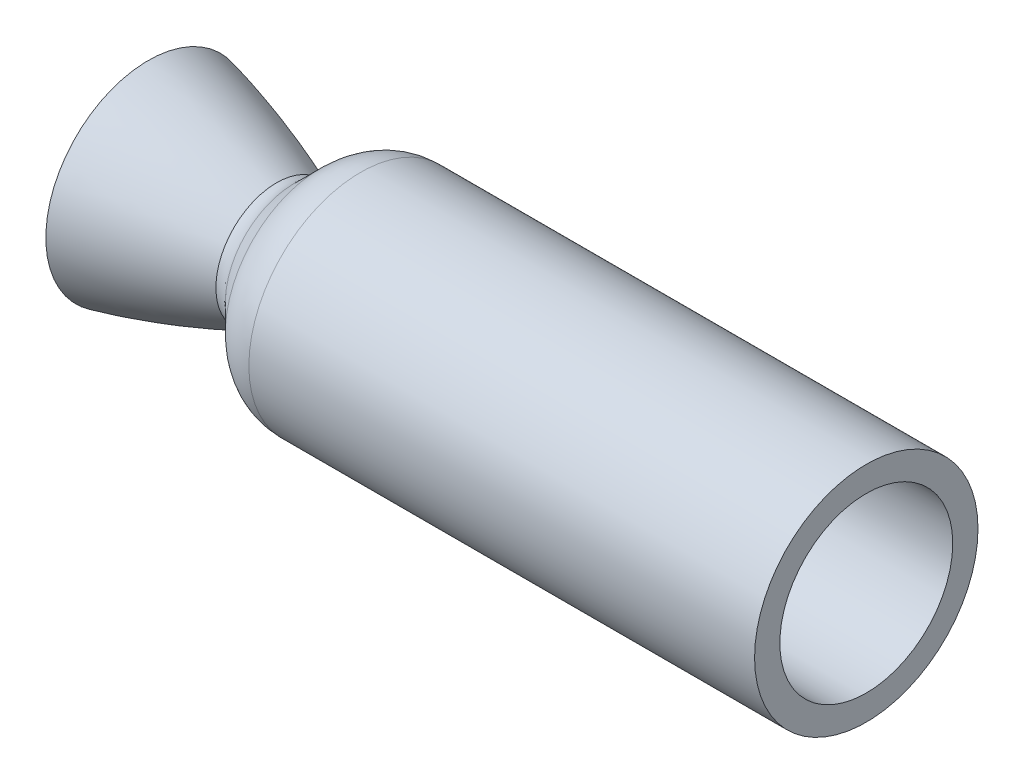
ISO-10303-21;
HEADER;
FILE_DESCRIPTION(('STEP AP214'),'2;1');
FILE_NAME('part.step','',(''),(''),'','','');
FILE_SCHEMA(('AUTOMOTIVE_DESIGN { 1 0 10303 214 1 1 1 1 }'));
ENDSEC;
DATA;
#1=APPLICATION_CONTEXT('core data for automotive mechanical design processes');
#2=APPLICATION_PROTOCOL_DEFINITION('international standard','automotive_design',2000,#1);
#3=PRODUCT_CONTEXT('',#1,'mechanical');
#4=PRODUCT('Part','Part','',(#3));
#5=PRODUCT_RELATED_PRODUCT_CATEGORY('part','',(#4));
#6=PRODUCT_DEFINITION_FORMATION('','',#4);
#7=PRODUCT_DEFINITION_CONTEXT('part definition',#1,'design');
#8=PRODUCT_DEFINITION('design','',#6,#7);
#9=PRODUCT_DEFINITION_SHAPE('','',#8);
#10=(LENGTH_UNIT() NAMED_UNIT(*) SI_UNIT(.MILLI.,.METRE.));
#11=(NAMED_UNIT(*) PLANE_ANGLE_UNIT() SI_UNIT($,.RADIAN.));
#12=(NAMED_UNIT(*) SI_UNIT($,.STERADIAN.) SOLID_ANGLE_UNIT());
#13=UNCERTAINTY_MEASURE_WITH_UNIT(LENGTH_MEASURE(1.E-05),#10,'distance_accuracy_value','');
#14=(GEOMETRIC_REPRESENTATION_CONTEXT(3) GLOBAL_UNCERTAINTY_ASSIGNED_CONTEXT((#13)) GLOBAL_UNIT_ASSIGNED_CONTEXT((#10,
#11,#12)) REPRESENTATION_CONTEXT('',''));
#15=CARTESIAN_POINT('',(0.,0.,0.));
#16=DIRECTION('',(0.,0.,1.));
#17=DIRECTION('',(1.,0.,0.));
#18=AXIS2_PLACEMENT_3D('',#15,#16,#17);
#19=CARTESIAN_POINT('',(1.66230944505193,0.,0.));
#20=DIRECTION('',(1.,0.,0.));
#21=DIRECTION('',(0.,0.,-1.));
#22=AXIS2_PLACEMENT_3D('',#19,#20,#21);
#23=TOROIDAL_SURFACE('',#22,28.,8.8);
#24=CARTESIAN_POINT('',(7.88484911949356,0.,0.));
#25=DIRECTION('',(1.,0.,0.));
#26=DIRECTION('',(0.,0.,-1.));
#27=AXIS2_PLACEMENT_3D('',#24,#25,#26);
#28=CIRCLE('',#27,21.7774603255584);
#29=CARTESIAN_POINT('',(7.88484911949356,0.,-21.7774603255584));
#30=VERTEX_POINT('',#29);
#31=EDGE_CURVE('E87',#30,#30,#28,.T.);
#32=ORIENTED_EDGE('',*,*,#31,.F.);
#33=EDGE_LOOP('',(#32));
#34=FACE_BOUND('',#33,.T.);
#35=CARTESIAN_POINT('',(2.34818467411675,0.,0.));
#36=DIRECTION('',(1.,0.,0.));
#37=DIRECTION('',(0.,0.,-1.));
#38=AXIS2_PLACEMENT_3D('',#35,#36,#37);
#39=CIRCLE('',#38,19.2267693994655);
#40=CARTESIAN_POINT('',(2.34818467411675,0.,-19.2267693994655));
#41=VERTEX_POINT('',#40);
#42=EDGE_CURVE('E10',#41,#41,#39,.T.);
#43=ORIENTED_EDGE('',*,*,#42,.T.);
#44=EDGE_LOOP('',(#43));
#45=FACE_BOUND('',#44,.T.);
#46=ADVANCED_FACE('F44',(#34,#45),#23,.F.);
#47=CARTESIAN_POINT('',(2.34818467411675,19.2267693994655,0.));
#48=CARTESIAN_POINT('',(-17.8277068362284,27.6653277651835,0.));
#49=CARTESIAN_POINT('',(-38.3150228285927,32.4320922392603,0.));
#50=B_SPLINE_CURVE_WITH_KNOTS('',2,(#47,#48,#49),.UNSPECIFIED.,.F.,.F.,(3,3),(0.018493807027929,
1.),.UNSPECIFIED.);
#51=CARTESIAN_POINT('',(0.,0.,0.));
#52=DIRECTION('',(1.,0.,0.));
#53=AXIS1_PLACEMENT('',#51,#52);
#54=SURFACE_OF_REVOLUTION('',#50,#53);
#55=CARTESIAN_POINT('',(-38.3150228285927,0.,0.));
#56=DIRECTION('',(1.,0.,0.));
#57=DIRECTION('',(0.,0.,-1.));
#58=AXIS2_PLACEMENT_3D('',#55,#56,#57);
#59=CIRCLE('',#58,32.4320922392603);
#60=CARTESIAN_POINT('',(-38.3150228285927,0.,-32.4320922392603));
#61=VERTEX_POINT('',#60);
#62=EDGE_CURVE('E50',#61,#61,#59,.T.);
#63=ORIENTED_EDGE('',*,*,#62,.T.);
#64=EDGE_LOOP('',(#63));
#65=FACE_BOUND('',#64,.T.);
#66=ORIENTED_EDGE('',*,*,#42,.F.);
#67=EDGE_LOOP('',(#66));
#68=FACE_BOUND('',#67,.T.);
#69=ADVANCED_FACE('F110',(#65,#68),#54,.F.);
#70=CARTESIAN_POINT('',(-40.1270102829806,0.,0.));
#71=DIRECTION('',(1.,0.,0.));
#72=DIRECTION('',(0.,0.,-1.));
#73=AXIS2_PLACEMENT_3D('',#70,#71,#72);
#74=CONICAL_SURFACE('',#73,24.64,1.34231515229828);
#75=ORIENTED_EDGE('',*,*,#62,.F.);
#76=EDGE_LOOP('',(#75));
#77=FACE_BOUND('',#76,.T.);
#78=CARTESIAN_POINT('',(-40.1270102829806,0.,0.));
#79=DIRECTION('',(1.,0.,0.));
#80=DIRECTION('',(0.,0.,-1.));
#81=AXIS2_PLACEMENT_3D('',#78,#79,#80);
#82=CIRCLE('',#81,24.64);
#83=CARTESIAN_POINT('',(-40.1270102829806,0.,-24.64));
#84=VERTEX_POINT('',#83);
#85=EDGE_CURVE('E54',#84,#84,#82,.T.);
#86=ORIENTED_EDGE('',*,*,#85,.T.);
#87=EDGE_LOOP('',(#86));
#88=FACE_BOUND('',#87,.T.);
#89=ADVANCED_FACE('F106',(#77,#88),#74,.T.);
#90=CARTESIAN_POINT('',(0.,11.5361374682942,0.));
#91=CARTESIAN_POINT('',(-19.9482573544596,19.9475956971547,0.));
#92=CARTESIAN_POINT('',(-40.1270102829806,24.64,0.));
#93=B_SPLINE_CURVE_WITH_KNOTS('',2,(#90,#91,#92),.UNSPECIFIED.,.F.,.F.,(3,3),(0.,1.),.UNSPECIFIED.);
#94=CARTESIAN_POINT('',(0.,0.,0.));
#95=DIRECTION('',(1.,0.,0.));
#96=AXIS1_PLACEMENT('',#94,#95);
#97=SURFACE_OF_REVOLUTION('',#93,#96);
#98=ORIENTED_EDGE('',*,*,#85,.F.);
#99=EDGE_LOOP('',(#98));
#100=FACE_BOUND('',#99,.T.);
#101=CARTESIAN_POINT('',(0.,0.,0.));
#102=DIRECTION('',(1.,0.,0.));
#103=DIRECTION('',(0.,0.,-1.));
#104=AXIS2_PLACEMENT_3D('',#101,#102,#103);
#105=CIRCLE('',#104,11.5361374682942);
#106=CARTESIAN_POINT('',(0.,0.,-11.5361374682942));
#107=VERTEX_POINT('',#106);
#108=EDGE_CURVE('E58',#107,#107,#105,.T.);
#109=ORIENTED_EDGE('',*,*,#108,.T.);
#110=EDGE_LOOP('',(#109));
#111=FACE_BOUND('',#110,.T.);
#112=ADVANCED_FACE('F101',(#100,#111),#97,.T.);
#113=CARTESIAN_POINT('',(1.66230944505193,0.,0.));
#114=DIRECTION('',(1.,0.,0.));
#115=DIRECTION('',(0.,0.,-1.));
#116=AXIS2_PLACEMENT_3D('',#113,#114,#115);
#117=TOROIDAL_SURFACE('',#116,15.4784,4.2784);
#118=ORIENTED_EDGE('',*,*,#108,.F.);
#119=EDGE_LOOP('',(#118));
#120=FACE_BOUND('',#119,.T.);
#121=CARTESIAN_POINT('',(1.66230944505193,0.,0.));
#122=DIRECTION('',(1.,0.,0.));
#123=DIRECTION('',(0.,0.,-1.));
#124=AXIS2_PLACEMENT_3D('',#121,#122,#123);
#125=CIRCLE('',#124,11.2);
#126=CARTESIAN_POINT('',(1.66230944505193,0.,-11.2));
#127=VERTEX_POINT('',#126);
#128=EDGE_CURVE('E63',#127,#127,#125,.T.);
#129=ORIENTED_EDGE('',*,*,#128,.T.);
#130=EDGE_LOOP('',(#129));
#131=FACE_BOUND('',#130,.T.);
#132=ADVANCED_FACE('F105',(#120,#131),#117,.T.);
#133=CARTESIAN_POINT('',(1.66230944505193,0.,0.));
#134=DIRECTION('',(1.,0.,0.));
#135=DIRECTION('',(0.,0.,-1.));
#136=AXIS2_PLACEMENT_3D('',#133,#134,#135);
#137=TOROIDAL_SURFACE('',#136,28.,16.8);
#138=ORIENTED_EDGE('',*,*,#128,.F.);
#139=EDGE_LOOP('',(#138));
#140=FACE_BOUND('',#139,.T.);
#141=CARTESIAN_POINT('',(13.5417033689859,0.,0.));
#142=DIRECTION('',(1.,0.,0.));
#143=DIRECTION('',(0.,0.,-1.));
#144=AXIS2_PLACEMENT_3D('',#141,#142,#143);
#145=CIRCLE('',#144,16.120606076066);
#146=CARTESIAN_POINT('',(13.5417033689859,0.,-16.120606076066));
#147=VERTEX_POINT('',#146);
#148=EDGE_CURVE('E66',#147,#147,#145,.T.);
#149=ORIENTED_EDGE('',*,*,#148,.T.);
#150=EDGE_LOOP('',(#149));
#151=FACE_BOUND('',#150,.T.);
#152=ADVANCED_FACE('F160',(#140,#151),#137,.T.);
#153=CARTESIAN_POINT('',(21.8781691214359,0.,0.));
#154=DIRECTION('',(1.,0.,0.));
#155=DIRECTION('',(0.,0.,-1.));
#156=AXIS2_PLACEMENT_3D('',#153,#154,#155);
#157=CONICAL_SURFACE('',#156,24.457071828516,0.785398163397449);
#158=ORIENTED_EDGE('',*,*,#148,.F.);
#159=EDGE_LOOP('',(#158));
#160=FACE_BOUND('',#159,.T.);
#161=CARTESIAN_POINT('',(21.8781691214359,0.,0.));
#162=DIRECTION('',(1.,0.,0.));
#163=DIRECTION('',(0.,0.,-1.));
#164=AXIS2_PLACEMENT_3D('',#161,#162,#163);
#165=CIRCLE('',#164,24.457071828516);
#166=CARTESIAN_POINT('',(21.8781691214359,0.,-24.457071828516));
#167=VERTEX_POINT('',#166);
#168=EDGE_CURVE('E69',#167,#167,#165,.T.);
#169=ORIENTED_EDGE('',*,*,#168,.T.);
#170=EDGE_LOOP('',(#169));
#171=FACE_BOUND('',#170,.T.);
#172=ADVANCED_FACE('F154',(#160,#171),#157,.F.);
#173=CARTESIAN_POINT('',(28.9492369333014,0.,0.));
#174=DIRECTION('',(1.,0.,0.));
#175=DIRECTION('',(0.,0.,-1.));
#176=AXIS2_PLACEMENT_3D('',#173,#174,#175);
#177=TOROIDAL_SURFACE('',#176,17.3860040166505,10.);
#178=ORIENTED_EDGE('',*,*,#168,.F.);
#179=EDGE_LOOP('',(#178));
#180=FACE_BOUND('',#179,.T.);
#181=CARTESIAN_POINT('',(28.9492369333014,0.,0.));
#182=DIRECTION('',(1.,0.,0.));
#183=DIRECTION('',(0.,0.,-1.));
#184=AXIS2_PLACEMENT_3D('',#181,#182,#183);
#185=CIRCLE('',#184,27.3860040166505);
#186=CARTESIAN_POINT('',(28.9492369333014,0.,-27.3860040166505));
#187=VERTEX_POINT('',#186);
#188=EDGE_CURVE('E72',#187,#187,#185,.T.);
#189=ORIENTED_EDGE('',*,*,#188,.T.);
#190=EDGE_LOOP('',(#189));
#191=FACE_BOUND('',#190,.T.);
#192=ADVANCED_FACE('F148',(#180,#191),#177,.F.);
#193=CARTESIAN_POINT('',(0.,0.,0.));
#194=DIRECTION('',(1.,0.,0.));
#195=DIRECTION('',(0.,0.,-1.));
#196=AXIS2_PLACEMENT_3D('',#193,#194,#195);
#197=CYLINDRICAL_SURFACE('',#196,27.3860040166505);
#198=ORIENTED_EDGE('',*,*,#188,.F.);
#199=EDGE_LOOP('',(#198));
#200=FACE_BOUND('',#199,.T.);
#201=CARTESIAN_POINT('',(189.133015330605,0.,0.));
#202=DIRECTION('',(1.,0.,0.));
#203=DIRECTION('',(0.,0.,-1.));
#204=AXIS2_PLACEMENT_3D('',#201,#202,#203);
#205=CIRCLE('',#204,27.3860040166505);
#206=CARTESIAN_POINT('',(189.133015330605,0.,-27.3860040166505));
#207=VERTEX_POINT('',#206);
#208=EDGE_CURVE('E75',#207,#207,#205,.T.);
#209=ORIENTED_EDGE('',*,*,#208,.T.);
#210=EDGE_LOOP('',(#209));
#211=FACE_BOUND('',#210,.T.);
#212=ADVANCED_FACE('F143',(#200,#211),#197,.F.);
#213=CARTESIAN_POINT('',(189.133015330605,0.,0.));
#214=DIRECTION('',(1.,0.,0.));
#215=DIRECTION('',(0.,0.,-1.));
#216=AXIS2_PLACEMENT_3D('',#213,#214,#215);
#217=PLANE('',#216);
#218=CARTESIAN_POINT('',(189.133015330605,0.,0.));
#219=DIRECTION('',(1.,0.,0.));
#220=DIRECTION('',(0.,0.,-1.));
#221=AXIS2_PLACEMENT_3D('',#218,#219,#220);
#222=CIRCLE('',#221,35.3860040166505);
#223=CARTESIAN_POINT('',(189.133015330605,0.,-35.3860040166505));
#224=VERTEX_POINT('',#223);
#225=EDGE_CURVE('E78',#224,#224,#222,.T.);
#226=ORIENTED_EDGE('',*,*,#225,.T.);
#227=EDGE_LOOP('',(#226));
#228=FACE_BOUND('',#227,.T.);
#229=ORIENTED_EDGE('',*,*,#208,.F.);
#230=EDGE_LOOP('',(#229));
#231=FACE_BOUND('',#230,.T.);
#232=ADVANCED_FACE('F137',(#228,#231),#217,.T.);
#233=CARTESIAN_POINT('',(0.,0.,0.));
#234=DIRECTION('',(1.,0.,0.));
#235=DIRECTION('',(0.,0.,-1.));
#236=AXIS2_PLACEMENT_3D('',#233,#234,#235);
#237=CYLINDRICAL_SURFACE('',#236,35.3860040166505);
#238=CARTESIAN_POINT('',(28.9492369333014,0.,0.));
#239=DIRECTION('',(1.,0.,0.));
#240=DIRECTION('',(0.,0.,-1.));
#241=AXIS2_PLACEMENT_3D('',#238,#239,#240);
#242=CIRCLE('',#241,35.3860040166505);
#243=CARTESIAN_POINT('',(28.9492369333014,0.,-35.3860040166505));
#244=VERTEX_POINT('',#243);
#245=EDGE_CURVE('E81',#244,#244,#242,.T.);
#246=ORIENTED_EDGE('',*,*,#245,.T.);
#247=EDGE_LOOP('',(#246));
#248=FACE_BOUND('',#247,.T.);
#249=ORIENTED_EDGE('',*,*,#225,.F.);
#250=EDGE_LOOP('',(#249));
#251=FACE_BOUND('',#250,.T.);
#252=ADVANCED_FACE('F131',(#248,#251),#237,.T.);
#253=CARTESIAN_POINT('',(28.9492369333014,0.,0.));
#254=DIRECTION('',(1.,0.,0.));
#255=DIRECTION('',(0.,0.,-1.));
#256=AXIS2_PLACEMENT_3D('',#253,#254,#255);
#257=DEGENERATE_TOROIDAL_SURFACE('',#256,17.3860040166505,18.,.T.);
#258=CARTESIAN_POINT('',(16.2213148719435,0.,0.));
#259=DIRECTION('',(1.,0.,0.));
#260=DIRECTION('',(0.,0.,-1.));
#261=AXIS2_PLACEMENT_3D('',#258,#259,#260);
#262=CIRCLE('',#261,30.1139260780083);
#263=CARTESIAN_POINT('',(16.2213148719435,0.,-30.1139260780083));
#264=VERTEX_POINT('',#263);
#265=EDGE_CURVE('E84',#264,#264,#262,.T.);
#266=ORIENTED_EDGE('',*,*,#265,.T.);
#267=EDGE_LOOP('',(#266));
#268=FACE_BOUND('',#267,.T.);
#269=ORIENTED_EDGE('',*,*,#245,.F.);
#270=EDGE_LOOP('',(#269));
#271=FACE_BOUND('',#270,.T.);
#272=ADVANCED_FACE('F125',(#268,#271),#257,.T.);
#273=CARTESIAN_POINT('',(16.2213148719435,0.,0.));
#274=DIRECTION('',(1.,0.,0.));
#275=DIRECTION('',(0.,0.,-1.));
#276=AXIS2_PLACEMENT_3D('',#273,#274,#275);
#277=CONICAL_SURFACE('',#276,30.1139260780083,0.785398163397451);
#278=ORIENTED_EDGE('',*,*,#31,.T.);
#279=EDGE_LOOP('',(#278));
#280=FACE_BOUND('',#279,.T.);
#281=ORIENTED_EDGE('',*,*,#265,.F.);
#282=EDGE_LOOP('',(#281));
#283=FACE_BOUND('',#282,.T.);
#284=ADVANCED_FACE('F122',(#280,#283),#277,.T.);
#285=CLOSED_SHELL('',(#46,#69,#89,#112,#132,#152,#172,#192,#212,#232,#252,#272,#284));
#286=MANIFOLD_SOLID_BREP('B2',#285);
#287=ADVANCED_BREP_SHAPE_REPRESENTATION('',(#18,#286),#14);
#288=SHAPE_DEFINITION_REPRESENTATION(#9,#287);
ENDSEC;
END-ISO-10303-21;
